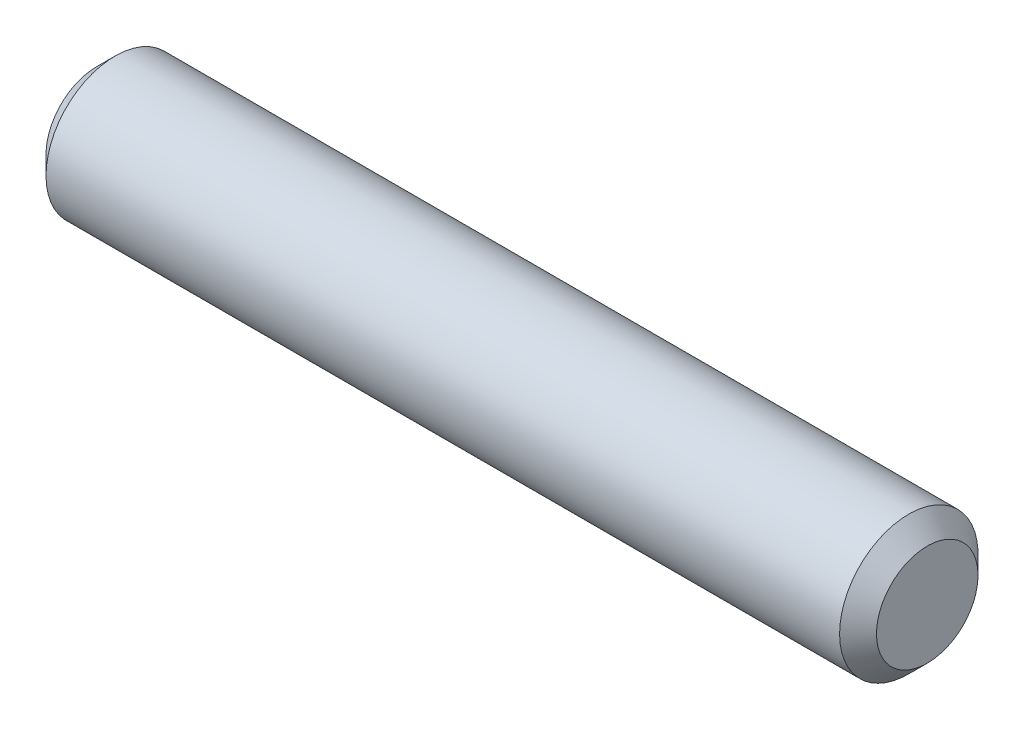
ISO-10303-21;
HEADER;
FILE_DESCRIPTION(('STEP AP214'),'2;1');
FILE_NAME('part.step','',(''),(''),'','','');
FILE_SCHEMA(('AUTOMOTIVE_DESIGN { 1 0 10303 214 1 1 1 1 }'));
ENDSEC;
DATA;
#1=APPLICATION_CONTEXT('core data for automotive mechanical design processes');
#2=APPLICATION_PROTOCOL_DEFINITION('international standard','automotive_design',2000,#1);
#3=PRODUCT_CONTEXT('',#1,'mechanical');
#4=PRODUCT('Part','Part','',(#3));
#5=PRODUCT_RELATED_PRODUCT_CATEGORY('part','',(#4));
#6=PRODUCT_DEFINITION_FORMATION('','',#4);
#7=PRODUCT_DEFINITION_CONTEXT('part definition',#1,'design');
#8=PRODUCT_DEFINITION('design','',#6,#7);
#9=PRODUCT_DEFINITION_SHAPE('','',#8);
#10=(LENGTH_UNIT() NAMED_UNIT(*) SI_UNIT(.MILLI.,.METRE.));
#11=(NAMED_UNIT(*) PLANE_ANGLE_UNIT() SI_UNIT($,.RADIAN.));
#12=(NAMED_UNIT(*) SI_UNIT($,.STERADIAN.) SOLID_ANGLE_UNIT());
#13=UNCERTAINTY_MEASURE_WITH_UNIT(LENGTH_MEASURE(1.E-05),#10,'distance_accuracy_value','');
#14=(GEOMETRIC_REPRESENTATION_CONTEXT(3) GLOBAL_UNCERTAINTY_ASSIGNED_CONTEXT((#13)) GLOBAL_UNIT_ASSIGNED_CONTEXT((#10,
#11,#12)) REPRESENTATION_CONTEXT('',''));
#15=CARTESIAN_POINT('',(0.,0.,0.));
#16=DIRECTION('',(0.,0.,1.));
#17=DIRECTION('',(1.,0.,0.));
#18=AXIS2_PLACEMENT_3D('',#15,#16,#17);
#19=CARTESIAN_POINT('',(-7.19377162629758,-1.94636678200692,0.));
#20=DIRECTION('',(-1.,0.,0.));
#21=DIRECTION('',(0.,0.,1.));
#22=AXIS2_PLACEMENT_3D('',#19,#20,#21);
#23=PLANE('',#22);
#24=CARTESIAN_POINT('',(-7.19377162629758,-1.94636678200692,0.));
#25=DIRECTION('',(-1.,0.,0.));
#26=DIRECTION('',(0.,0.,1.));
#27=AXIS2_PLACEMENT_3D('',#24,#25,#26);
#28=CIRCLE('',#27,0.55);
#29=CARTESIAN_POINT('',(-7.19377162629758,-1.94636678200692,0.55));
#30=VERTEX_POINT('',#29);
#31=EDGE_CURVE('E10',#30,#30,#28,.T.);
#32=ORIENTED_EDGE('',*,*,#31,.T.);
#33=EDGE_LOOP('',(#32));
#34=FACE_BOUND('',#33,.T.);
#35=ADVANCED_FACE('F41',(#34),#23,.T.);
#36=CARTESIAN_POINT('',(-7.19377162629758,-1.94636678200692,0.));
#37=DIRECTION('',(1.,0.,0.));
#38=DIRECTION('',(0.,0.,-1.));
#39=AXIS2_PLACEMENT_3D('',#36,#37,#38);
#40=CONICAL_SURFACE('',#39,0.55,0.785398163397449);
#41=CARTESIAN_POINT('',(-6.99377162629758,-1.94636678200692,0.));
#42=DIRECTION('',(-1.,0.,0.));
#43=DIRECTION('',(0.,0.,1.));
#44=AXIS2_PLACEMENT_3D('',#41,#42,#43);
#45=CIRCLE('',#44,0.75);
#46=CARTESIAN_POINT('',(-6.99377162629758,-1.94636678200692,0.75));
#47=VERTEX_POINT('',#46);
#48=EDGE_CURVE('E48',#47,#47,#45,.T.);
#49=ORIENTED_EDGE('',*,*,#48,.T.);
#50=EDGE_LOOP('',(#49));
#51=FACE_BOUND('',#50,.T.);
#52=ORIENTED_EDGE('',*,*,#31,.F.);
#53=EDGE_LOOP('',(#52));
#54=FACE_BOUND('',#53,.T.);
#55=ADVANCED_FACE('F77',(#51,#54),#40,.T.);
#56=CARTESIAN_POINT('',(-7.19377162629758,-1.94636678200692,0.));
#57=DIRECTION('',(-1.,0.,0.));
#58=DIRECTION('',(0.,0.,1.));
#59=AXIS2_PLACEMENT_3D('',#56,#57,#58);
#60=CYLINDRICAL_SURFACE('',#59,0.75);
#61=CARTESIAN_POINT('',(1.60622837370242,-1.94636678200692,0.));
#62=DIRECTION('',(-1.,0.,0.));
#63=DIRECTION('',(0.,0.,1.));
#64=AXIS2_PLACEMENT_3D('',#61,#62,#63);
#65=CIRCLE('',#64,0.75);
#66=CARTESIAN_POINT('',(1.60622837370242,-1.94636678200692,0.75));
#67=VERTEX_POINT('',#66);
#68=EDGE_CURVE('E53',#67,#67,#65,.T.);
#69=ORIENTED_EDGE('',*,*,#68,.T.);
#70=EDGE_LOOP('',(#69));
#71=FACE_BOUND('',#70,.T.);
#72=ORIENTED_EDGE('',*,*,#48,.F.);
#73=EDGE_LOOP('',(#72));
#74=FACE_BOUND('',#73,.T.);
#75=ADVANCED_FACE('F74',(#71,#74),#60,.T.);
#76=CARTESIAN_POINT('',(1.60622837370242,-1.94636678200692,0.));
#77=DIRECTION('',(-1.,0.,0.));
#78=DIRECTION('',(0.,0.,1.));
#79=AXIS2_PLACEMENT_3D('',#76,#77,#78);
#80=CONICAL_SURFACE('',#79,0.75,0.785398163397447);
#81=CARTESIAN_POINT('',(1.80622837370242,-1.94636678200692,0.));
#82=DIRECTION('',(-1.,0.,0.));
#83=DIRECTION('',(0.,0.,1.));
#84=AXIS2_PLACEMENT_3D('',#81,#82,#83);
#85=CIRCLE('',#84,0.55);
#86=CARTESIAN_POINT('',(1.80622837370242,-1.94636678200692,0.55));
#87=VERTEX_POINT('',#86);
#88=EDGE_CURVE('E58',#87,#87,#85,.T.);
#89=ORIENTED_EDGE('',*,*,#88,.T.);
#90=EDGE_LOOP('',(#89));
#91=FACE_BOUND('',#90,.T.);
#92=ORIENTED_EDGE('',*,*,#68,.F.);
#93=EDGE_LOOP('',(#92));
#94=FACE_BOUND('',#93,.T.);
#95=ADVANCED_FACE('F65',(#91,#94),#80,.T.);
#96=CARTESIAN_POINT('',(1.80622837370242,-1.94636678200692,0.));
#97=DIRECTION('',(1.,0.,0.));
#98=DIRECTION('',(0.,0.,-1.));
#99=AXIS2_PLACEMENT_3D('',#96,#97,#98);
#100=PLANE('',#99);
#101=ORIENTED_EDGE('',*,*,#88,.F.);
#102=EDGE_LOOP('',(#101));
#103=FACE_BOUND('',#102,.T.);
#104=ADVANCED_FACE('F68',(#103),#100,.T.);
#105=CLOSED_SHELL('',(#35,#55,#75,#95,#104));
#106=MANIFOLD_SOLID_BREP('B2',#105);
#107=ADVANCED_BREP_SHAPE_REPRESENTATION('',(#18,#106),#14);
#108=SHAPE_DEFINITION_REPRESENTATION(#9,#107);
ENDSEC;
END-ISO-10303-21;
